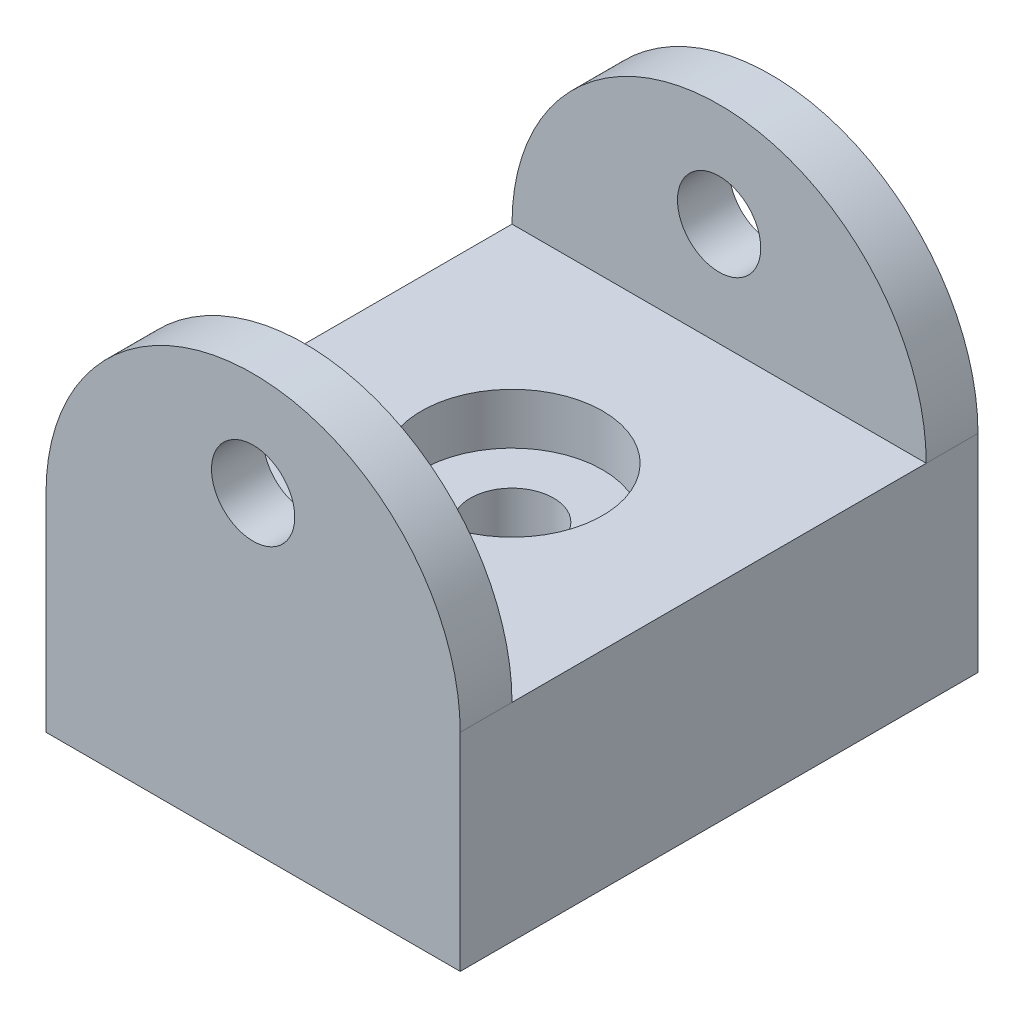
ISO-10303-21;
HEADER;
FILE_DESCRIPTION(('STEP AP214'),'2;1');
FILE_NAME('part.step','',(''),(''),'','','');
FILE_SCHEMA(('AUTOMOTIVE_DESIGN { 1 0 10303 214 1 1 1 1 }'));
ENDSEC;
DATA;
#1=APPLICATION_CONTEXT('core data for automotive mechanical design processes');
#2=APPLICATION_PROTOCOL_DEFINITION('international standard','automotive_design',2000,#1);
#3=PRODUCT_CONTEXT('',#1,'mechanical');
#4=PRODUCT('Part','Part','',(#3));
#5=PRODUCT_RELATED_PRODUCT_CATEGORY('part','',(#4));
#6=PRODUCT_DEFINITION_FORMATION('','',#4);
#7=PRODUCT_DEFINITION_CONTEXT('part definition',#1,'design');
#8=PRODUCT_DEFINITION('design','',#6,#7);
#9=PRODUCT_DEFINITION_SHAPE('','',#8);
#10=(LENGTH_UNIT() NAMED_UNIT(*) SI_UNIT(.MILLI.,.METRE.));
#11=(NAMED_UNIT(*) PLANE_ANGLE_UNIT() SI_UNIT($,.RADIAN.));
#12=(NAMED_UNIT(*) SI_UNIT($,.STERADIAN.) SOLID_ANGLE_UNIT());
#13=UNCERTAINTY_MEASURE_WITH_UNIT(LENGTH_MEASURE(1.E-05),#10,'distance_accuracy_value','');
#14=(GEOMETRIC_REPRESENTATION_CONTEXT(3) GLOBAL_UNCERTAINTY_ASSIGNED_CONTEXT((#13)) GLOBAL_UNIT_ASSIGNED_CONTEXT((#10,
#11,#12)) REPRESENTATION_CONTEXT('',''));
#15=CARTESIAN_POINT('',(0.,0.,0.));
#16=DIRECTION('',(0.,0.,1.));
#17=DIRECTION('',(1.,0.,0.));
#18=AXIS2_PLACEMENT_3D('',#15,#16,#17);
#19=CARTESIAN_POINT('',(0.,0.,-15.875));
#20=DIRECTION('',(0.,0.,-1.));
#21=DIRECTION('',(-1.,0.,0.));
#22=AXIS2_PLACEMENT_3D('',#19,#20,#21);
#23=PLANE('',#22);
#24=CARTESIAN_POINT('',(0.,0.,-15.875));
#25=DIRECTION('',(0.,0.,1.));
#26=DIRECTION('',(-1.,0.,0.));
#27=AXIS2_PLACEMENT_3D('',#24,#25,#26);
#28=CIRCLE('',#27,12.7);
#29=CARTESIAN_POINT('',(12.7,0.,-15.875));
#30=VERTEX_POINT('',#29);
#31=CARTESIAN_POINT('',(-12.7,0.,-15.875));
#32=VERTEX_POINT('',#31);
#33=EDGE_CURVE('E150',#30,#32,#28,.T.);
#34=ORIENTED_EDGE('',*,*,#33,.F.);
#35=DIRECTION('',(0.,1.,0.));
#36=VECTOR('',#35,1.);
#37=CARTESIAN_POINT('',(12.7,-12.7,-15.875));
#38=LINE('',#37,#36);
#39=CARTESIAN_POINT('',(12.7,-12.7,-15.875));
#40=VERTEX_POINT('',#39);
#41=EDGE_CURVE('E140',#40,#30,#38,.T.);
#42=ORIENTED_EDGE('',*,*,#41,.F.);
#43=DIRECTION('',(1.,0.,0.));
#44=VECTOR('',#43,1.);
#45=CARTESIAN_POINT('',(-12.7,-12.7,-15.875));
#46=LINE('',#45,#44);
#47=CARTESIAN_POINT('',(-12.7,-12.7,-15.875));
#48=VERTEX_POINT('',#47);
#49=EDGE_CURVE('E144',#48,#40,#46,.T.);
#50=ORIENTED_EDGE('',*,*,#49,.F.);
#51=DIRECTION('',(0.,-1.,0.));
#52=VECTOR('',#51,1.);
#53=CARTESIAN_POINT('',(-12.7,0.,-15.875));
#54=LINE('',#53,#52);
#55=EDGE_CURVE('E147',#32,#48,#54,.T.);
#56=ORIENTED_EDGE('',*,*,#55,.F.);
#57=EDGE_LOOP('',(#34,#42,#50,#56));
#58=FACE_BOUND('',#57,.T.);
#59=CARTESIAN_POINT('',(0.,6.35,-15.875));
#60=DIRECTION('',(0.,0.,1.));
#61=DIRECTION('',(1.,0.,0.));
#62=AXIS2_PLACEMENT_3D('',#59,#60,#61);
#63=CIRCLE('',#62,2.55269999999999);
#64=CARTESIAN_POINT('',(2.55269999999999,6.35,-15.875));
#65=VERTEX_POINT('',#64);
#66=EDGE_CURVE('E170',#65,#65,#63,.T.);
#67=ORIENTED_EDGE('',*,*,#66,.T.);
#68=EDGE_LOOP('',(#67));
#69=FACE_BOUND('',#68,.T.);
#70=ADVANCED_FACE('F38',(#58,#69),#23,.T.);
#71=CARTESIAN_POINT('',(0.,0.,15.875));
#72=DIRECTION('',(0.,0.,-1.));
#73=DIRECTION('',(-1.,0.,0.));
#74=AXIS2_PLACEMENT_3D('',#71,#72,#73);
#75=CYLINDRICAL_SURFACE('',#74,12.7);
#76=CARTESIAN_POINT('',(0.,0.,-12.7));
#77=DIRECTION('',(0.,0.,-1.));
#78=DIRECTION('',(0.,1.,0.));
#79=AXIS2_PLACEMENT_3D('',#76,#77,#78);
#80=CIRCLE('',#79,12.7);
#81=CARTESIAN_POINT('',(-12.7,0.,-12.7));
#82=VERTEX_POINT('',#81);
#83=CARTESIAN_POINT('',(12.7,0.,-12.7));
#84=VERTEX_POINT('',#83);
#85=EDGE_CURVE('E11',#82,#84,#80,.T.);
#86=ORIENTED_EDGE('',*,*,#85,.T.);
#87=DIRECTION('',(0.,0.,-1.));
#88=VECTOR('',#87,1.);
#89=CARTESIAN_POINT('',(12.7,0.,15.875));
#90=LINE('',#89,#88);
#91=EDGE_CURVE('E83',#84,#30,#90,.T.);
#92=ORIENTED_EDGE('',*,*,#91,.T.);
#93=ORIENTED_EDGE('',*,*,#33,.T.);
#94=DIRECTION('',(0.,0.,-1.));
#95=VECTOR('',#94,1.);
#96=CARTESIAN_POINT('',(-12.7,0.,15.875));
#97=LINE('',#96,#95);
#98=EDGE_CURVE('E126',#82,#32,#97,.T.);
#99=ORIENTED_EDGE('',*,*,#98,.F.);
#100=EDGE_LOOP('',(#86,#92,#93,#99));
#101=FACE_BOUND('',#100,.T.);
#102=ADVANCED_FACE('F213',(#101),#75,.T.);
#103=CARTESIAN_POINT('',(12.7,0.,15.875));
#104=VERTEX_POINT('',#103);
#105=CARTESIAN_POINT('',(12.7,0.,12.7));
#106=VERTEX_POINT('',#105);
#107=EDGE_CURVE('E121',#104,#106,#90,.T.);
#108=ORIENTED_EDGE('',*,*,#107,.T.);
#109=CARTESIAN_POINT('',(0.,0.,12.7));
#110=DIRECTION('',(0.,0.,1.));
#111=DIRECTION('',(1.,0.,0.));
#112=AXIS2_PLACEMENT_3D('',#109,#110,#111);
#113=CIRCLE('',#112,12.7);
#114=CARTESIAN_POINT('',(-12.7,0.,12.7));
#115=VERTEX_POINT('',#114);
#116=EDGE_CURVE('E48',#106,#115,#113,.T.);
#117=ORIENTED_EDGE('',*,*,#116,.T.);
#118=CARTESIAN_POINT('',(-12.7,0.,15.875));
#119=VERTEX_POINT('',#118);
#120=EDGE_CURVE('E120',#119,#115,#97,.T.);
#121=ORIENTED_EDGE('',*,*,#120,.F.);
#122=CARTESIAN_POINT('',(0.,0.,15.875));
#123=DIRECTION('',(0.,0.,1.));
#124=DIRECTION('',(-1.,0.,0.));
#125=AXIS2_PLACEMENT_3D('',#122,#123,#124);
#126=CIRCLE('',#125,12.7);
#127=EDGE_CURVE('E143',#104,#119,#126,.T.);
#128=ORIENTED_EDGE('',*,*,#127,.F.);
#129=EDGE_LOOP('',(#108,#117,#121,#128));
#130=FACE_BOUND('',#129,.T.);
#131=ADVANCED_FACE('F40',(#130),#75,.T.);
#132=CARTESIAN_POINT('',(-12.7,0.,15.875));
#133=DIRECTION('',(1.,0.,0.));
#134=DIRECTION('',(0.,1.,0.));
#135=AXIS2_PLACEMENT_3D('',#132,#133,#134);
#136=PLANE('',#135);
#137=ORIENTED_EDGE('',*,*,#55,.T.);
#138=DIRECTION('',(0.,0.,-1.));
#139=VECTOR('',#138,1.);
#140=CARTESIAN_POINT('',(-12.7,-12.7,15.875));
#141=LINE('',#140,#139);
#142=CARTESIAN_POINT('',(-12.7,-12.7,15.875));
#143=VERTEX_POINT('',#142);
#144=EDGE_CURVE('E129',#143,#48,#141,.T.);
#145=ORIENTED_EDGE('',*,*,#144,.F.);
#146=DIRECTION('',(0.,-1.,0.));
#147=VECTOR('',#146,1.);
#148=CARTESIAN_POINT('',(-12.7,0.,15.875));
#149=LINE('',#148,#147);
#150=EDGE_CURVE('E91',#119,#143,#149,.T.);
#151=ORIENTED_EDGE('',*,*,#150,.F.);
#152=ORIENTED_EDGE('',*,*,#120,.T.);
#153=DIRECTION('',(0.,0.,-1.));
#154=VECTOR('',#153,1.);
#155=CARTESIAN_POINT('',(-12.7,0.,-12.7));
#156=LINE('',#155,#154);
#157=EDGE_CURVE('E106',#115,#82,#156,.T.);
#158=ORIENTED_EDGE('',*,*,#157,.T.);
#159=ORIENTED_EDGE('',*,*,#98,.T.);
#160=EDGE_LOOP('',(#137,#145,#151,#152,#158,#159));
#161=FACE_BOUND('',#160,.T.);
#162=ADVANCED_FACE('F124',(#161),#136,.F.);
#163=CARTESIAN_POINT('',(-12.7,-12.7,15.875));
#164=DIRECTION('',(0.,1.,0.));
#165=DIRECTION('',(-1.,0.,0.));
#166=AXIS2_PLACEMENT_3D('',#163,#164,#165);
#167=PLANE('',#166);
#168=CARTESIAN_POINT('',(0.,-12.7,0.));
#169=DIRECTION('',(0.,1.,0.));
#170=DIRECTION('',(0.,0.,1.));
#171=AXIS2_PLACEMENT_3D('',#168,#169,#170);
#172=CIRCLE('',#171,2.55270000000001);
#173=CARTESIAN_POINT('',(0.,-12.7,2.5527));
#174=VERTEX_POINT('',#173);
#175=EDGE_CURVE('E178',#174,#174,#172,.T.);
#176=ORIENTED_EDGE('',*,*,#175,.T.);
#177=EDGE_LOOP('',(#176));
#178=FACE_BOUND('',#177,.T.);
#179=ORIENTED_EDGE('',*,*,#49,.T.);
#180=DIRECTION('',(0.,0.,-1.));
#181=VECTOR('',#180,1.);
#182=CARTESIAN_POINT('',(12.7,-12.7,15.875));
#183=LINE('',#182,#181);
#184=CARTESIAN_POINT('',(12.7,-12.7,15.875));
#185=VERTEX_POINT('',#184);
#186=EDGE_CURVE('E134',#185,#40,#183,.T.);
#187=ORIENTED_EDGE('',*,*,#186,.F.);
#188=DIRECTION('',(1.,0.,0.));
#189=VECTOR('',#188,1.);
#190=CARTESIAN_POINT('',(-12.7,-12.7,15.875));
#191=LINE('',#190,#189);
#192=EDGE_CURVE('E155',#143,#185,#191,.T.);
#193=ORIENTED_EDGE('',*,*,#192,.F.);
#194=ORIENTED_EDGE('',*,*,#144,.T.);
#195=EDGE_LOOP('',(#179,#187,#193,#194));
#196=FACE_BOUND('',#195,.T.);
#197=ADVANCED_FACE('F228',(#178,#196),#167,.F.);
#198=CARTESIAN_POINT('',(12.7,-12.7,15.875));
#199=DIRECTION('',(-1.,0.,0.));
#200=DIRECTION('',(0.,-1.,0.));
#201=AXIS2_PLACEMENT_3D('',#198,#199,#200);
#202=PLANE('',#201);
#203=ORIENTED_EDGE('',*,*,#41,.T.);
#204=ORIENTED_EDGE('',*,*,#91,.F.);
#205=DIRECTION('',(0.,0.,-1.));
#206=VECTOR('',#205,1.);
#207=CARTESIAN_POINT('',(12.7,0.,-12.7));
#208=LINE('',#207,#206);
#209=EDGE_CURVE('E114',#106,#84,#208,.T.);
#210=ORIENTED_EDGE('',*,*,#209,.F.);
#211=ORIENTED_EDGE('',*,*,#107,.F.);
#212=DIRECTION('',(0.,1.,0.));
#213=VECTOR('',#212,1.);
#214=CARTESIAN_POINT('',(12.7,-12.7,15.875));
#215=LINE('',#214,#213);
#216=EDGE_CURVE('E62',#185,#104,#215,.T.);
#217=ORIENTED_EDGE('',*,*,#216,.F.);
#218=ORIENTED_EDGE('',*,*,#186,.T.);
#219=EDGE_LOOP('',(#203,#204,#210,#211,#217,#218));
#220=FACE_BOUND('',#219,.T.);
#221=ADVANCED_FACE('F225',(#220),#202,.F.);
#222=CARTESIAN_POINT('',(0.,0.,15.875));
#223=DIRECTION('',(0.,0.,-1.));
#224=DIRECTION('',(-1.,0.,0.));
#225=AXIS2_PLACEMENT_3D('',#222,#223,#224);
#226=PLANE('',#225);
#227=CARTESIAN_POINT('',(0.,6.35,15.875));
#228=DIRECTION('',(0.,0.,1.));
#229=DIRECTION('',(1.,0.,0.));
#230=AXIS2_PLACEMENT_3D('',#227,#228,#229);
#231=CIRCLE('',#230,2.5527);
#232=CARTESIAN_POINT('',(2.5527,6.35,15.875));
#233=VERTEX_POINT('',#232);
#234=EDGE_CURVE('E174',#233,#233,#231,.T.);
#235=ORIENTED_EDGE('',*,*,#234,.F.);
#236=EDGE_LOOP('',(#235));
#237=FACE_BOUND('',#236,.T.);
#238=ORIENTED_EDGE('',*,*,#127,.T.);
#239=ORIENTED_EDGE('',*,*,#150,.T.);
#240=ORIENTED_EDGE('',*,*,#192,.T.);
#241=ORIENTED_EDGE('',*,*,#216,.T.);
#242=EDGE_LOOP('',(#238,#239,#240,#241));
#243=FACE_BOUND('',#242,.T.);
#244=ADVANCED_FACE('F223',(#237,#243),#226,.F.);
#245=CARTESIAN_POINT('',(-12.7,12.7,-12.7));
#246=DIRECTION('',(0.,0.,-1.));
#247=DIRECTION('',(0.,1.,0.));
#248=AXIS2_PLACEMENT_3D('',#245,#246,#247);
#249=PLANE('',#248);
#250=CARTESIAN_POINT('',(0.,6.35,-12.7));
#251=DIRECTION('',(0.,0.,-1.));
#252=DIRECTION('',(0.,1.,0.));
#253=AXIS2_PLACEMENT_3D('',#250,#251,#252);
#254=CIRCLE('',#253,2.55269999999999);
#255=CARTESIAN_POINT('',(0.,8.90269999999999,-12.7));
#256=VERTEX_POINT('',#255);
#257=EDGE_CURVE('E42',#256,#256,#254,.T.);
#258=ORIENTED_EDGE('',*,*,#257,.T.);
#259=EDGE_LOOP('',(#258));
#260=FACE_BOUND('',#259,.T.);
#261=ORIENTED_EDGE('',*,*,#85,.F.);
#262=DIRECTION('',(1.,0.,0.));
#263=VECTOR('',#262,1.);
#264=CARTESIAN_POINT('',(-12.7,0.,-12.7));
#265=LINE('',#264,#263);
#266=EDGE_CURVE('E105',#82,#84,#265,.T.);
#267=ORIENTED_EDGE('',*,*,#266,.T.);
#268=EDGE_LOOP('',(#261,#267));
#269=FACE_BOUND('',#268,.T.);
#270=ADVANCED_FACE('F209',(#260,#269),#249,.F.);
#271=CARTESIAN_POINT('',(-12.7,0.,12.7));
#272=DIRECTION('',(0.,0.,1.));
#273=DIRECTION('',(1.,0.,0.));
#274=AXIS2_PLACEMENT_3D('',#271,#272,#273);
#275=PLANE('',#274);
#276=CARTESIAN_POINT('',(0.,6.35,12.7));
#277=DIRECTION('',(0.,0.,1.));
#278=DIRECTION('',(1.,0.,0.));
#279=AXIS2_PLACEMENT_3D('',#276,#277,#278);
#280=CIRCLE('',#279,2.55269999999999);
#281=CARTESIAN_POINT('',(2.55269999999999,6.35,12.7));
#282=VERTEX_POINT('',#281);
#283=EDGE_CURVE('E165',#282,#282,#280,.T.);
#284=ORIENTED_EDGE('',*,*,#283,.T.);
#285=EDGE_LOOP('',(#284));
#286=FACE_BOUND('',#285,.T.);
#287=DIRECTION('',(1.,0.,0.));
#288=VECTOR('',#287,1.);
#289=CARTESIAN_POINT('',(-12.7,0.,12.7));
#290=LINE('',#289,#288);
#291=EDGE_CURVE('E98',#115,#106,#290,.T.);
#292=ORIENTED_EDGE('',*,*,#291,.F.);
#293=ORIENTED_EDGE('',*,*,#116,.F.);
#294=EDGE_LOOP('',(#292,#293));
#295=FACE_BOUND('',#294,.T.);
#296=ADVANCED_FACE('F100',(#286,#295),#275,.F.);
#297=CARTESIAN_POINT('',(-12.7,0.,-12.7));
#298=DIRECTION('',(0.,-1.,0.));
#299=DIRECTION('',(0.,0.,-1.));
#300=AXIS2_PLACEMENT_3D('',#297,#298,#299);
#301=PLANE('',#300);
#302=CARTESIAN_POINT('',(0.,0.,0.));
#303=DIRECTION('',(0.,1.,0.));
#304=DIRECTION('',(0.,0.,1.));
#305=AXIS2_PLACEMENT_3D('',#302,#303,#304);
#306=CIRCLE('',#305,5.55625);
#307=CARTESIAN_POINT('',(0.,0.,5.55625));
#308=VERTEX_POINT('',#307);
#309=EDGE_CURVE('E190',#308,#308,#306,.T.);
#310=ORIENTED_EDGE('',*,*,#309,.F.);
#311=EDGE_LOOP('',(#310));
#312=FACE_BOUND('',#311,.T.);
#313=ORIENTED_EDGE('',*,*,#209,.T.);
#314=ORIENTED_EDGE('',*,*,#266,.F.);
#315=ORIENTED_EDGE('',*,*,#157,.F.);
#316=ORIENTED_EDGE('',*,*,#291,.T.);
#317=EDGE_LOOP('',(#313,#314,#315,#316));
#318=FACE_BOUND('',#317,.T.);
#319=ADVANCED_FACE('F110',(#312,#318),#301,.F.);
#320=CARTESIAN_POINT('',(0.,6.35,15.875));
#321=DIRECTION('',(0.,0.,1.));
#322=DIRECTION('',(1.,0.,0.));
#323=AXIS2_PLACEMENT_3D('',#320,#321,#322);
#324=CYLINDRICAL_SURFACE('',#323,2.55269999999999);
#325=ORIENTED_EDGE('',*,*,#66,.F.);
#326=EDGE_LOOP('',(#325));
#327=FACE_BOUND('',#326,.T.);
#328=ORIENTED_EDGE('',*,*,#257,.F.);
#329=EDGE_LOOP('',(#328));
#330=FACE_BOUND('',#329,.T.);
#331=ADVANCED_FACE('F198',(#327,#330),#324,.F.);
#332=ORIENTED_EDGE('',*,*,#234,.T.);
#333=EDGE_LOOP('',(#332));
#334=FACE_BOUND('',#333,.T.);
#335=ORIENTED_EDGE('',*,*,#283,.F.);
#336=EDGE_LOOP('',(#335));
#337=FACE_BOUND('',#336,.T.);
#338=ADVANCED_FACE('F205',(#334,#337),#324,.F.);
#339=CARTESIAN_POINT('',(0.,0.,0.));
#340=DIRECTION('',(0.,1.,0.));
#341=DIRECTION('',(0.,0.,1.));
#342=AXIS2_PLACEMENT_3D('',#339,#340,#341);
#343=CYLINDRICAL_SURFACE('',#342,2.5527);
#344=ORIENTED_EDGE('',*,*,#175,.F.);
#345=EDGE_LOOP('',(#344));
#346=FACE_BOUND('',#345,.T.);
#347=CARTESIAN_POINT('',(0.,-3.1242,0.));
#348=DIRECTION('',(0.,1.,0.));
#349=DIRECTION('',(0.,0.,1.));
#350=AXIS2_PLACEMENT_3D('',#347,#348,#349);
#351=CIRCLE('',#350,2.5527);
#352=CARTESIAN_POINT('',(0.,-3.1242,2.5527));
#353=VERTEX_POINT('',#352);
#354=EDGE_CURVE('E182',#353,#353,#351,.T.);
#355=ORIENTED_EDGE('',*,*,#354,.T.);
#356=EDGE_LOOP('',(#355));
#357=FACE_BOUND('',#356,.T.);
#358=ADVANCED_FACE('F283',(#346,#357),#343,.F.);
#359=CARTESIAN_POINT('',(2.5527,-3.1242,0.));
#360=DIRECTION('',(0.,-1.,0.));
#361=DIRECTION('',(0.,0.,-1.));
#362=AXIS2_PLACEMENT_3D('',#359,#360,#361);
#363=PLANE('',#362);
#364=ORIENTED_EDGE('',*,*,#354,.F.);
#365=EDGE_LOOP('',(#364));
#366=FACE_BOUND('',#365,.T.);
#367=CARTESIAN_POINT('',(0.,-3.1242,0.));
#368=DIRECTION('',(0.,1.,0.));
#369=DIRECTION('',(0.,0.,1.));
#370=AXIS2_PLACEMENT_3D('',#367,#368,#369);
#371=CIRCLE('',#370,5.55625);
#372=CARTESIAN_POINT('',(0.,-3.1242,5.55625));
#373=VERTEX_POINT('',#372);
#374=EDGE_CURVE('E186',#373,#373,#371,.T.);
#375=ORIENTED_EDGE('',*,*,#374,.T.);
#376=EDGE_LOOP('',(#375));
#377=FACE_BOUND('',#376,.T.);
#378=ADVANCED_FACE('F290',(#366,#377),#363,.F.);
#379=CARTESIAN_POINT('',(0.,0.,0.));
#380=DIRECTION('',(0.,1.,0.));
#381=DIRECTION('',(0.,0.,1.));
#382=AXIS2_PLACEMENT_3D('',#379,#380,#381);
#383=CYLINDRICAL_SURFACE('',#382,5.55625);
#384=ORIENTED_EDGE('',*,*,#374,.F.);
#385=EDGE_LOOP('',(#384));
#386=FACE_BOUND('',#385,.T.);
#387=ORIENTED_EDGE('',*,*,#309,.T.);
#388=EDGE_LOOP('',(#387));
#389=FACE_BOUND('',#388,.T.);
#390=ADVANCED_FACE('F195',(#386,#389),#383,.F.);
#391=CLOSED_SHELL('',(#70,#102,#131,#162,#197,#221,#244,#270,#296,#319,#331,#338,#358,#378,#390));
#392=MANIFOLD_SOLID_BREP('B2',#391);
#393=ADVANCED_BREP_SHAPE_REPRESENTATION('',(#18,#392),#14);
#394=SHAPE_DEFINITION_REPRESENTATION(#9,#393);
ENDSEC;
END-ISO-10303-21;
